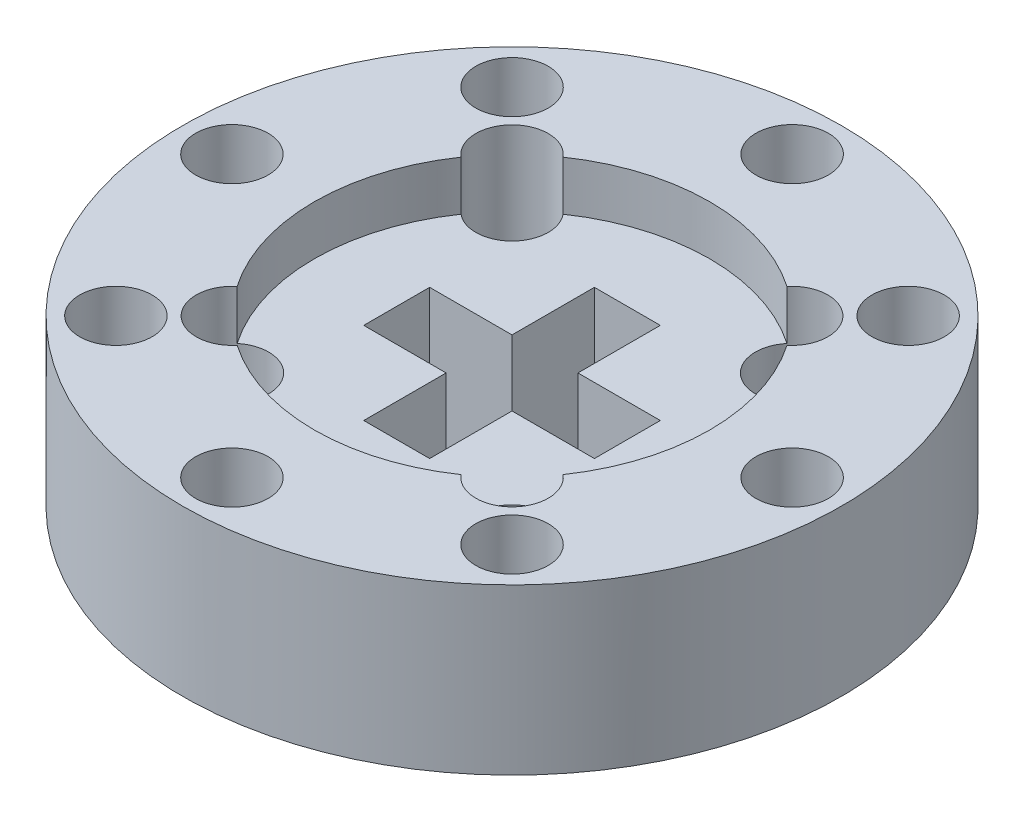
ISO-10303-21;
HEADER;
FILE_DESCRIPTION(('STEP AP214'),'2;1');
FILE_NAME('part.step','',(''),(''),'','','');
FILE_SCHEMA(('AUTOMOTIVE_DESIGN { 1 0 10303 214 1 1 1 1 }'));
ENDSEC;
DATA;
#1=APPLICATION_CONTEXT('core data for automotive mechanical design processes');
#2=APPLICATION_PROTOCOL_DEFINITION('international standard','automotive_design',2000,#1);
#3=PRODUCT_CONTEXT('',#1,'mechanical');
#4=PRODUCT('Part','Part','',(#3));
#5=PRODUCT_RELATED_PRODUCT_CATEGORY('part','',(#4));
#6=PRODUCT_DEFINITION_FORMATION('','',#4);
#7=PRODUCT_DEFINITION_CONTEXT('part definition',#1,'design');
#8=PRODUCT_DEFINITION('design','',#6,#7);
#9=PRODUCT_DEFINITION_SHAPE('','',#8);
#10=(LENGTH_UNIT() NAMED_UNIT(*) SI_UNIT(.MILLI.,.METRE.));
#11=(NAMED_UNIT(*) PLANE_ANGLE_UNIT() SI_UNIT($,.RADIAN.));
#12=(NAMED_UNIT(*) SI_UNIT($,.STERADIAN.) SOLID_ANGLE_UNIT());
#13=UNCERTAINTY_MEASURE_WITH_UNIT(LENGTH_MEASURE(1.E-05),#10,'distance_accuracy_value','');
#14=(GEOMETRIC_REPRESENTATION_CONTEXT(3) GLOBAL_UNCERTAINTY_ASSIGNED_CONTEXT((#13)) GLOBAL_UNIT_ASSIGNED_CONTEXT((#10,
#11,#12)) REPRESENTATION_CONTEXT('',''));
#15=CARTESIAN_POINT('',(0.,0.,0.));
#16=DIRECTION('',(0.,0.,1.));
#17=DIRECTION('',(1.,0.,0.));
#18=AXIS2_PLACEMENT_3D('',#15,#16,#17);
#19=CARTESIAN_POINT('',(0.,0.,0.));
#20=DIRECTION('',(0.,1.,0.));
#21=DIRECTION('',(0.,0.,1.));
#22=AXIS2_PLACEMENT_3D('',#19,#20,#21);
#23=PLANE('',#22);
#24=DIRECTION('',(0.,0.,-1.));
#25=VECTOR('',#24,1.);
#26=CARTESIAN_POINT('',(1.,0.,1.));
#27=LINE('',#26,#25);
#28=CARTESIAN_POINT('',(1.,0.,3.5));
#29=VERTEX_POINT('',#28);
#30=CARTESIAN_POINT('',(1.,0.,1.));
#31=VERTEX_POINT('',#30);
#32=EDGE_CURVE('E248',#29,#31,#27,.T.);
#33=ORIENTED_EDGE('',*,*,#32,.T.);
#34=DIRECTION('',(1.,0.,0.));
#35=VECTOR('',#34,1.);
#36=CARTESIAN_POINT('',(1.,0.,1.));
#37=LINE('',#36,#35);
#38=CARTESIAN_POINT('',(3.5,0.,1.));
#39=VERTEX_POINT('',#38);
#40=EDGE_CURVE('E255',#31,#39,#37,.T.);
#41=ORIENTED_EDGE('',*,*,#40,.T.);
#42=DIRECTION('',(0.,0.,-1.));
#43=VECTOR('',#42,1.);
#44=CARTESIAN_POINT('',(3.5,0.,-1.));
#45=LINE('',#44,#43);
#46=CARTESIAN_POINT('',(3.5,0.,-1.));
#47=VERTEX_POINT('',#46);
#48=EDGE_CURVE('E259',#39,#47,#45,.T.);
#49=ORIENTED_EDGE('',*,*,#48,.T.);
#50=DIRECTION('',(-1.,0.,0.));
#51=VECTOR('',#50,1.);
#52=CARTESIAN_POINT('',(1.,0.,-1.));
#53=LINE('',#52,#51);
#54=CARTESIAN_POINT('',(1.,0.,-1.));
#55=VERTEX_POINT('',#54);
#56=EDGE_CURVE('E263',#47,#55,#53,.T.);
#57=ORIENTED_EDGE('',*,*,#56,.T.);
#58=DIRECTION('',(0.,0.,-1.));
#59=VECTOR('',#58,1.);
#60=CARTESIAN_POINT('',(0.999999999999999,0.,-3.5));
#61=LINE('',#60,#59);
#62=CARTESIAN_POINT('',(0.999999999999999,0.,-3.5));
#63=VERTEX_POINT('',#62);
#64=EDGE_CURVE('E267',#55,#63,#61,.T.);
#65=ORIENTED_EDGE('',*,*,#64,.T.);
#66=DIRECTION('',(-1.,0.,0.));
#67=VECTOR('',#66,1.);
#68=CARTESIAN_POINT('',(-1.,0.,-3.5));
#69=LINE('',#68,#67);
#70=CARTESIAN_POINT('',(-1.,0.,-3.5));
#71=VERTEX_POINT('',#70);
#72=EDGE_CURVE('E271',#63,#71,#69,.T.);
#73=ORIENTED_EDGE('',*,*,#72,.T.);
#74=DIRECTION('',(0.,0.,1.));
#75=VECTOR('',#74,1.);
#76=CARTESIAN_POINT('',(-1.,0.,-3.5));
#77=LINE('',#76,#75);
#78=CARTESIAN_POINT('',(-1.,0.,-1.));
#79=VERTEX_POINT('',#78);
#80=EDGE_CURVE('E275',#71,#79,#77,.T.);
#81=ORIENTED_EDGE('',*,*,#80,.T.);
#82=DIRECTION('',(-1.,0.,0.));
#83=VECTOR('',#82,1.);
#84=CARTESIAN_POINT('',(-3.5,0.,-1.));
#85=LINE('',#84,#83);
#86=CARTESIAN_POINT('',(-3.5,0.,-1.));
#87=VERTEX_POINT('',#86);
#88=EDGE_CURVE('E279',#79,#87,#85,.T.);
#89=ORIENTED_EDGE('',*,*,#88,.T.);
#90=DIRECTION('',(0.,0.,1.));
#91=VECTOR('',#90,1.);
#92=CARTESIAN_POINT('',(-3.5,0.,-1.));
#93=LINE('',#92,#91);
#94=CARTESIAN_POINT('',(-3.5,0.,1.));
#95=VERTEX_POINT('',#94);
#96=EDGE_CURVE('E283',#87,#95,#93,.T.);
#97=ORIENTED_EDGE('',*,*,#96,.T.);
#98=DIRECTION('',(1.,0.,0.));
#99=VECTOR('',#98,1.);
#100=CARTESIAN_POINT('',(-3.5,0.,1.));
#101=LINE('',#100,#99);
#102=CARTESIAN_POINT('',(-1.,0.,1.));
#103=VERTEX_POINT('',#102);
#104=EDGE_CURVE('E287',#95,#103,#101,.T.);
#105=ORIENTED_EDGE('',*,*,#104,.T.);
#106=DIRECTION('',(0.,0.,1.));
#107=VECTOR('',#106,1.);
#108=CARTESIAN_POINT('',(-1.,0.,1.));
#109=LINE('',#108,#107);
#110=CARTESIAN_POINT('',(-1.,0.,3.5));
#111=VERTEX_POINT('',#110);
#112=EDGE_CURVE('E291',#103,#111,#109,.T.);
#113=ORIENTED_EDGE('',*,*,#112,.T.);
#114=DIRECTION('',(1.,0.,0.));
#115=VECTOR('',#114,1.);
#116=CARTESIAN_POINT('',(-1.,0.,3.5));
#117=LINE('',#116,#115);
#118=EDGE_CURVE('E295',#111,#29,#117,.T.);
#119=ORIENTED_EDGE('',*,*,#118,.T.);
#120=EDGE_LOOP('',(#33,#41,#49,#57,#65,#73,#81,#89,#97,#105,#113,#119));
#121=FACE_BOUND('',#120,.T.);
#122=CARTESIAN_POINT('',(0.,0.,0.));
#123=DIRECTION('',(0.,-1.,0.));
#124=DIRECTION('',(0.,0.,-1.));
#125=AXIS2_PLACEMENT_3D('',#122,#123,#124);
#126=CIRCLE('',#125,4.5);
#127=CARTESIAN_POINT('',(0.,0.,-4.5));
#128=VERTEX_POINT('',#127);
#129=EDGE_CURVE('E799',#128,#128,#126,.T.);
#130=ORIENTED_EDGE('',*,*,#129,.T.);
#131=EDGE_LOOP('',(#130));
#132=FACE_BOUND('',#131,.T.);
#133=ADVANCED_FACE('F38',(#121,#132),#23,.F.);
#134=CARTESIAN_POINT('',(0.,7.,0.));
#135=DIRECTION('',(0.,-1.,0.));
#136=DIRECTION('',(0.,0.,-1.));
#137=AXIS2_PLACEMENT_3D('',#134,#135,#136);
#138=CYLINDRICAL_SURFACE('',#137,10.);
#139=CARTESIAN_POINT('',(0.,7.,0.));
#140=DIRECTION('',(0.,1.,0.));
#141=DIRECTION('',(0.,0.,1.));
#142=AXIS2_PLACEMENT_3D('',#139,#140,#141);
#143=CIRCLE('',#142,10.);
#144=CARTESIAN_POINT('',(0.,7.,10.));
#145=VERTEX_POINT('',#144);
#146=EDGE_CURVE('E335',#145,#145,#143,.T.);
#147=ORIENTED_EDGE('',*,*,#146,.F.);
#148=EDGE_LOOP('',(#147));
#149=FACE_BOUND('',#148,.T.);
#150=CARTESIAN_POINT('',(0.,2.,0.));
#151=DIRECTION('',(0.,-1.,0.));
#152=DIRECTION('',(0.,0.,-1.));
#153=AXIS2_PLACEMENT_3D('',#150,#151,#152);
#154=CIRCLE('',#153,10.);
#155=CARTESIAN_POINT('',(0.,2.,-10.));
#156=VERTEX_POINT('',#155);
#157=EDGE_CURVE('E803',#156,#156,#154,.T.);
#158=ORIENTED_EDGE('',*,*,#157,.F.);
#159=EDGE_LOOP('',(#158));
#160=FACE_BOUND('',#159,.T.);
#161=ADVANCED_FACE('F40',(#149,#160),#138,.T.);
#162=CARTESIAN_POINT('',(6.01040764008566,0.,6.01040764008565));
#163=DIRECTION('',(0.,1.,0.));
#164=DIRECTION('',(0.,0.,1.));
#165=AXIS2_PLACEMENT_3D('',#162,#163,#164);
#166=CYLINDRICAL_SURFACE('',#165,1.1);
#167=CARTESIAN_POINT('',(6.01040764008566,7.,6.01040764008565));
#168=DIRECTION('',(0.,1.,0.));
#169=DIRECTION('',(0.,0.,1.));
#170=AXIS2_PLACEMENT_3D('',#167,#168,#169);
#171=CIRCLE('',#170,1.1);
#172=CARTESIAN_POINT('',(6.01040764008566,7.,7.11040764008565));
#173=VERTEX_POINT('',#172);
#174=EDGE_CURVE('E224',#173,#173,#171,.T.);
#175=ORIENTED_EDGE('',*,*,#174,.T.);
#176=EDGE_LOOP('',(#175));
#177=FACE_BOUND('',#176,.T.);
#178=CARTESIAN_POINT('',(6.01040764008566,2.,6.01040764008565));
#179=DIRECTION('',(0.,-1.,0.));
#180=DIRECTION('',(0.,0.,-1.));
#181=AXIS2_PLACEMENT_3D('',#178,#179,#180);
#182=CIRCLE('',#181,1.1);
#183=CARTESIAN_POINT('',(6.01040764008566,2.,4.91040764008565));
#184=VERTEX_POINT('',#183);
#185=EDGE_CURVE('E189',#184,#184,#182,.F.);
#186=ORIENTED_EDGE('',*,*,#185,.F.);
#187=EDGE_LOOP('',(#186));
#188=FACE_BOUND('',#187,.T.);
#189=ADVANCED_FACE('F469',(#177,#188),#166,.F.);
#190=CARTESIAN_POINT('',(-6.01040764008566,0.,-6.01040764008565));
#191=DIRECTION('',(0.,1.,0.));
#192=DIRECTION('',(0.,0.,1.));
#193=AXIS2_PLACEMENT_3D('',#190,#191,#192);
#194=CYLINDRICAL_SURFACE('',#193,1.1);
#195=CARTESIAN_POINT('',(-6.01040764008566,7.,-6.01040764008565));
#196=DIRECTION('',(0.,1.,0.));
#197=DIRECTION('',(0.,0.,1.));
#198=AXIS2_PLACEMENT_3D('',#195,#196,#197);
#199=CIRCLE('',#198,1.1);
#200=CARTESIAN_POINT('',(-6.01040764008566,7.,-4.91040764008565));
#201=VERTEX_POINT('',#200);
#202=EDGE_CURVE('E244',#201,#201,#199,.T.);
#203=ORIENTED_EDGE('',*,*,#202,.T.);
#204=EDGE_LOOP('',(#203));
#205=FACE_BOUND('',#204,.T.);
#206=CARTESIAN_POINT('',(-6.01040764008566,2.,-6.01040764008565));
#207=DIRECTION('',(0.,-1.,0.));
#208=DIRECTION('',(0.,0.,-1.));
#209=AXIS2_PLACEMENT_3D('',#206,#207,#208);
#210=CIRCLE('',#209,1.1);
#211=CARTESIAN_POINT('',(-6.01040764008566,2.,-7.11040764008565));
#212=VERTEX_POINT('',#211);
#213=EDGE_CURVE('E845',#212,#212,#210,.F.);
#214=ORIENTED_EDGE('',*,*,#213,.F.);
#215=EDGE_LOOP('',(#214));
#216=FACE_BOUND('',#215,.T.);
#217=ADVANCED_FACE('F525',(#205,#216),#194,.F.);
#218=CARTESIAN_POINT('',(-8.5,0.,0.));
#219=DIRECTION('',(0.,1.,0.));
#220=DIRECTION('',(0.,0.,1.));
#221=AXIS2_PLACEMENT_3D('',#218,#219,#220);
#222=CYLINDRICAL_SURFACE('',#221,1.1);
#223=CARTESIAN_POINT('',(-8.5,7.,0.));
#224=DIRECTION('',(0.,1.,0.));
#225=DIRECTION('',(-0.707106781186544,0.,-0.707106781186551));
#226=AXIS2_PLACEMENT_3D('',#223,#224,#225);
#227=CIRCLE('',#226,1.1);
#228=CARTESIAN_POINT('',(-9.2778174593052,7.,-0.777817459305247));
#229=VERTEX_POINT('',#228);
#230=EDGE_CURVE('E215',#229,#229,#227,.T.);
#231=ORIENTED_EDGE('',*,*,#230,.T.);
#232=EDGE_LOOP('',(#231));
#233=FACE_BOUND('',#232,.T.);
#234=CARTESIAN_POINT('',(-8.5,2.,0.));
#235=DIRECTION('',(0.,-1.,0.));
#236=DIRECTION('',(0.,0.,-1.));
#237=AXIS2_PLACEMENT_3D('',#234,#235,#236);
#238=CIRCLE('',#237,1.1);
#239=CARTESIAN_POINT('',(-8.5,2.,-1.10000000000004));
#240=VERTEX_POINT('',#239);
#241=EDGE_CURVE('E841',#240,#240,#238,.F.);
#242=ORIENTED_EDGE('',*,*,#241,.F.);
#243=EDGE_LOOP('',(#242));
#244=FACE_BOUND('',#243,.T.);
#245=ADVANCED_FACE('F529',(#233,#244),#222,.F.);
#246=CARTESIAN_POINT('',(0.,0.,8.5));
#247=DIRECTION('',(0.,1.,0.));
#248=DIRECTION('',(0.,0.,1.));
#249=AXIS2_PLACEMENT_3D('',#246,#247,#248);
#250=CYLINDRICAL_SURFACE('',#249,1.1);
#251=CARTESIAN_POINT('',(0.,7.,8.5));
#252=DIRECTION('',(0.,1.,0.));
#253=DIRECTION('',(-0.707106781186549,0.,0.707106781186546));
#254=AXIS2_PLACEMENT_3D('',#251,#252,#253);
#255=CIRCLE('',#254,1.1);
#256=CARTESIAN_POINT('',(-0.777817459305214,7.,9.2778174593052));
#257=VERTEX_POINT('',#256);
#258=EDGE_CURVE('E225',#257,#257,#255,.T.);
#259=ORIENTED_EDGE('',*,*,#258,.T.);
#260=EDGE_LOOP('',(#259));
#261=FACE_BOUND('',#260,.T.);
#262=CARTESIAN_POINT('',(0.,2.,8.5));
#263=DIRECTION('',(0.,-1.,0.));
#264=DIRECTION('',(0.,0.,-1.));
#265=AXIS2_PLACEMENT_3D('',#262,#263,#264);
#266=CIRCLE('',#265,1.1);
#267=CARTESIAN_POINT('',(0.,2.,7.4));
#268=VERTEX_POINT('',#267);
#269=EDGE_CURVE('E837',#268,#268,#266,.F.);
#270=ORIENTED_EDGE('',*,*,#269,.F.);
#271=EDGE_LOOP('',(#270));
#272=FACE_BOUND('',#271,.T.);
#273=ADVANCED_FACE('F533',(#261,#272),#250,.F.);
#274=CARTESIAN_POINT('',(6.01040764008567,0.,-6.01040764008563));
#275=DIRECTION('',(0.,1.,0.));
#276=DIRECTION('',(0.,0.,1.));
#277=AXIS2_PLACEMENT_3D('',#274,#275,#276);
#278=CYLINDRICAL_SURFACE('',#277,1.1);
#279=CARTESIAN_POINT('',(6.01040764008567,7.,-6.01040764008563));
#280=DIRECTION('',(0.,1.,0.));
#281=DIRECTION('',(-1.,0.,0.));
#282=AXIS2_PLACEMENT_3D('',#279,#280,#281);
#283=CIRCLE('',#282,1.1);
#284=CARTESIAN_POINT('',(4.91040764008567,7.,-6.01040764008564));
#285=VERTEX_POINT('',#284);
#286=EDGE_CURVE('E230',#285,#285,#283,.T.);
#287=ORIENTED_EDGE('',*,*,#286,.T.);
#288=EDGE_LOOP('',(#287));
#289=FACE_BOUND('',#288,.T.);
#290=CARTESIAN_POINT('',(6.01040764008567,2.,-6.01040764008563));
#291=DIRECTION('',(0.,-1.,0.));
#292=DIRECTION('',(0.,0.,-1.));
#293=AXIS2_PLACEMENT_3D('',#290,#291,#292);
#294=CIRCLE('',#293,1.1);
#295=CARTESIAN_POINT('',(6.01040764008567,2.,-7.11040764008564));
#296=VERTEX_POINT('',#295);
#297=EDGE_CURVE('E833',#296,#296,#294,.F.);
#298=ORIENTED_EDGE('',*,*,#297,.F.);
#299=EDGE_LOOP('',(#298));
#300=FACE_BOUND('',#299,.T.);
#301=ADVANCED_FACE('F535',(#289,#300),#278,.F.);
#302=CARTESIAN_POINT('',(-6.01040764008567,0.,6.01040764008564));
#303=DIRECTION('',(0.,1.,0.));
#304=DIRECTION('',(0.,0.,1.));
#305=AXIS2_PLACEMENT_3D('',#302,#303,#304);
#306=CYLINDRICAL_SURFACE('',#305,1.1);
#307=CARTESIAN_POINT('',(-6.01040764008567,7.,6.01040764008564));
#308=DIRECTION('',(0.,1.,0.));
#309=DIRECTION('',(-1.,0.,0.));
#310=AXIS2_PLACEMENT_3D('',#307,#308,#309);
#311=CIRCLE('',#310,1.1);
#312=CARTESIAN_POINT('',(-7.11040764008567,7.,6.01040764008563));
#313=VERTEX_POINT('',#312);
#314=EDGE_CURVE('E226',#313,#313,#311,.T.);
#315=ORIENTED_EDGE('',*,*,#314,.T.);
#316=EDGE_LOOP('',(#315));
#317=FACE_BOUND('',#316,.T.);
#318=CARTESIAN_POINT('',(-6.01040764008567,2.,6.01040764008564));
#319=DIRECTION('',(0.,-1.,0.));
#320=DIRECTION('',(0.,0.,-1.));
#321=AXIS2_PLACEMENT_3D('',#318,#319,#320);
#322=CIRCLE('',#321,1.1);
#323=CARTESIAN_POINT('',(-6.01040764008567,2.,4.91040764008564));
#324=VERTEX_POINT('',#323);
#325=EDGE_CURVE('E829',#324,#324,#322,.F.);
#326=ORIENTED_EDGE('',*,*,#325,.F.);
#327=EDGE_LOOP('',(#326));
#328=FACE_BOUND('',#327,.T.);
#329=ADVANCED_FACE('F538',(#317,#328),#306,.F.);
#330=CARTESIAN_POINT('',(8.5,0.,0.));
#331=DIRECTION('',(0.,1.,0.));
#332=DIRECTION('',(0.,0.,1.));
#333=AXIS2_PLACEMENT_3D('',#330,#331,#332);
#334=CYLINDRICAL_SURFACE('',#333,1.1);
#335=CARTESIAN_POINT('',(8.5,7.,0.));
#336=DIRECTION('',(0.,1.,0.));
#337=DIRECTION('',(-0.707106781186544,0.,-0.707106781186551));
#338=AXIS2_PLACEMENT_3D('',#335,#336,#337);
#339=CIRCLE('',#338,1.1);
#340=CARTESIAN_POINT('',(7.7221825406948,7.,-0.777817459305164));
#341=VERTEX_POINT('',#340);
#342=EDGE_CURVE('E231',#341,#341,#339,.T.);
#343=ORIENTED_EDGE('',*,*,#342,.T.);
#344=EDGE_LOOP('',(#343));
#345=FACE_BOUND('',#344,.T.);
#346=CARTESIAN_POINT('',(8.5,2.,0.));
#347=DIRECTION('',(0.,-1.,0.));
#348=DIRECTION('',(0.,0.,-1.));
#349=AXIS2_PLACEMENT_3D('',#346,#347,#348);
#350=CIRCLE('',#349,1.1);
#351=CARTESIAN_POINT('',(8.5,2.,-1.09999999999996));
#352=VERTEX_POINT('',#351);
#353=EDGE_CURVE('E825',#352,#352,#350,.F.);
#354=ORIENTED_EDGE('',*,*,#353,.F.);
#355=EDGE_LOOP('',(#354));
#356=FACE_BOUND('',#355,.T.);
#357=ADVANCED_FACE('F543',(#345,#356),#334,.F.);
#358=CARTESIAN_POINT('',(0.,0.,-8.5));
#359=DIRECTION('',(0.,1.,0.));
#360=DIRECTION('',(0.,0.,1.));
#361=AXIS2_PLACEMENT_3D('',#358,#359,#360);
#362=CYLINDRICAL_SURFACE('',#361,1.1);
#363=CARTESIAN_POINT('',(0.,7.,-8.5));
#364=DIRECTION('',(0.,1.,0.));
#365=DIRECTION('',(-0.707106781186549,0.,0.707106781186546));
#366=AXIS2_PLACEMENT_3D('',#363,#364,#365);
#367=CIRCLE('',#366,1.1);
#368=CARTESIAN_POINT('',(-0.777817459305191,7.,-7.7221825406948));
#369=VERTEX_POINT('',#368);
#370=EDGE_CURVE('E220',#369,#369,#367,.T.);
#371=ORIENTED_EDGE('',*,*,#370,.T.);
#372=EDGE_LOOP('',(#371));
#373=FACE_BOUND('',#372,.T.);
#374=CARTESIAN_POINT('',(0.,2.,-8.5));
#375=DIRECTION('',(0.,-1.,0.));
#376=DIRECTION('',(0.,0.,-1.));
#377=AXIS2_PLACEMENT_3D('',#374,#375,#376);
#378=CIRCLE('',#377,1.1);
#379=CARTESIAN_POINT('',(0.,2.,-9.6));
#380=VERTEX_POINT('',#379);
#381=EDGE_CURVE('E821',#380,#380,#378,.F.);
#382=ORIENTED_EDGE('',*,*,#381,.F.);
#383=EDGE_LOOP('',(#382));
#384=FACE_BOUND('',#383,.T.);
#385=ADVANCED_FACE('F546',(#373,#384),#362,.F.);
#386=CARTESIAN_POINT('',(4.24264068711929,0.,4.24264068711928));
#387=DIRECTION('',(0.,1.,0.));
#388=DIRECTION('',(0.,0.,1.));
#389=AXIS2_PLACEMENT_3D('',#386,#387,#388);
#390=CYLINDRICAL_SURFACE('',#389,1.1);
#391=CARTESIAN_POINT('',(4.24264068711929,5.5,4.24264068711928));
#392=DIRECTION('',(0.,1.,0.));
#393=DIRECTION('',(0.,0.,1.));
#394=AXIS2_PLACEMENT_3D('',#391,#392,#393);
#395=CIRCLE('',#394,1.1);
#396=CARTESIAN_POINT('',(3.39679810155799,5.5,4.94588340514129));
#397=VERTEX_POINT('',#396);
#398=CARTESIAN_POINT('',(4.9458834051413,5.5,3.39679810155798));
#399=VERTEX_POINT('',#398);
#400=EDGE_CURVE('E199',#397,#399,#395,.F.);
#401=ORIENTED_EDGE('',*,*,#400,.F.);
#402=DIRECTION('',(0.,1.,0.));
#403=VECTOR('',#402,1.);
#404=CARTESIAN_POINT('',(3.39679810155799,6.25,4.94588340514129));
#405=LINE('',#404,#403);
#406=CARTESIAN_POINT('',(3.39679810155799,7.,4.94588340514129));
#407=VERTEX_POINT('',#406);
#408=EDGE_CURVE('E180',#397,#407,#405,.T.);
#409=ORIENTED_EDGE('',*,*,#408,.T.);
#410=CARTESIAN_POINT('',(4.24264068711929,7.,4.24264068711928));
#411=DIRECTION('',(0.,1.,0.));
#412=DIRECTION('',(0.,0.,1.));
#413=AXIS2_PLACEMENT_3D('',#410,#411,#412);
#414=CIRCLE('',#413,1.1);
#415=CARTESIAN_POINT('',(4.9458834051413,7.,3.39679810155798));
#416=VERTEX_POINT('',#415);
#417=EDGE_CURVE('E198',#407,#416,#414,.T.);
#418=ORIENTED_EDGE('',*,*,#417,.T.);
#419=DIRECTION('',(0.,1.,0.));
#420=VECTOR('',#419,1.);
#421=CARTESIAN_POINT('',(4.9458834051413,6.25,3.39679810155798));
#422=LINE('',#421,#420);
#423=EDGE_CURVE('E202',#416,#399,#422,.F.);
#424=ORIENTED_EDGE('',*,*,#423,.T.);
#425=EDGE_LOOP('',(#401,#409,#418,#424));
#426=FACE_BOUND('',#425,.T.);
#427=CARTESIAN_POINT('',(4.24264068711929,2.,4.24264068711928));
#428=DIRECTION('',(0.,-1.,0.));
#429=DIRECTION('',(0.,0.,-1.));
#430=AXIS2_PLACEMENT_3D('',#427,#428,#429);
#431=CIRCLE('',#430,1.1);
#432=CARTESIAN_POINT('',(4.24264068711929,2.,3.14264068711928));
#433=VERTEX_POINT('',#432);
#434=EDGE_CURVE('E817',#433,#433,#431,.F.);
#435=ORIENTED_EDGE('',*,*,#434,.F.);
#436=EDGE_LOOP('',(#435));
#437=FACE_BOUND('',#436,.T.);
#438=ADVANCED_FACE('F195',(#426,#437),#390,.F.);
#439=CARTESIAN_POINT('',(-4.24264068711928,0.,-4.24264068711928));
#440=DIRECTION('',(0.,1.,0.));
#441=DIRECTION('',(0.,0.,1.));
#442=AXIS2_PLACEMENT_3D('',#439,#440,#441);
#443=CYLINDRICAL_SURFACE('',#442,1.1);
#444=CARTESIAN_POINT('',(-4.24264068711928,5.5,-4.24264068711928));
#445=DIRECTION('',(0.,1.,0.));
#446=DIRECTION('',(0.,0.,1.));
#447=AXIS2_PLACEMENT_3D('',#444,#445,#446);
#448=CIRCLE('',#447,1.1);
#449=CARTESIAN_POINT('',(-3.39679810155799,5.5,-4.9458834051413));
#450=VERTEX_POINT('',#449);
#451=CARTESIAN_POINT('',(-4.9458834051413,5.5,-3.39679810155799));
#452=VERTEX_POINT('',#451);
#453=EDGE_CURVE('E361',#450,#452,#448,.F.);
#454=ORIENTED_EDGE('',*,*,#453,.F.);
#455=DIRECTION('',(0.,1.,0.));
#456=VECTOR('',#455,1.);
#457=CARTESIAN_POINT('',(-3.39679810155799,6.25,-4.94588340514129));
#458=LINE('',#457,#456);
#459=CARTESIAN_POINT('',(-3.39679810155799,7.,-4.9458834051413));
#460=VERTEX_POINT('',#459);
#461=EDGE_CURVE('E360',#450,#460,#458,.T.);
#462=ORIENTED_EDGE('',*,*,#461,.T.);
#463=CARTESIAN_POINT('',(-4.24264068711928,7.,-4.24264068711928));
#464=DIRECTION('',(0.,1.,0.));
#465=DIRECTION('',(0.,0.,1.));
#466=AXIS2_PLACEMENT_3D('',#463,#464,#465);
#467=CIRCLE('',#466,1.1);
#468=CARTESIAN_POINT('',(-4.9458834051413,7.,-3.39679810155799));
#469=VERTEX_POINT('',#468);
#470=EDGE_CURVE('E209',#460,#469,#467,.T.);
#471=ORIENTED_EDGE('',*,*,#470,.T.);
#472=DIRECTION('',(0.,1.,0.));
#473=VECTOR('',#472,1.);
#474=CARTESIAN_POINT('',(-4.94588340514129,6.25,-3.39679810155799));
#475=LINE('',#474,#473);
#476=EDGE_CURVE('E359',#469,#452,#475,.F.);
#477=ORIENTED_EDGE('',*,*,#476,.T.);
#478=EDGE_LOOP('',(#454,#462,#471,#477));
#479=FACE_BOUND('',#478,.T.);
#480=CARTESIAN_POINT('',(-4.24264068711928,2.,-4.24264068711928));
#481=DIRECTION('',(0.,-1.,0.));
#482=DIRECTION('',(0.,0.,-1.));
#483=AXIS2_PLACEMENT_3D('',#480,#481,#482);
#484=CIRCLE('',#483,1.1);
#485=CARTESIAN_POINT('',(-4.24264068711928,2.,-5.34264068711929));
#486=VERTEX_POINT('',#485);
#487=EDGE_CURVE('E813',#486,#486,#484,.F.);
#488=ORIENTED_EDGE('',*,*,#487,.F.);
#489=EDGE_LOOP('',(#488));
#490=FACE_BOUND('',#489,.T.);
#491=ADVANCED_FACE('F357',(#479,#490),#443,.F.);
#492=CARTESIAN_POINT('',(4.24264068711927,0.,-4.2426406871193));
#493=DIRECTION('',(0.,1.,0.));
#494=DIRECTION('',(0.,0.,1.));
#495=AXIS2_PLACEMENT_3D('',#492,#493,#494);
#496=CYLINDRICAL_SURFACE('',#495,1.1);
#497=CARTESIAN_POINT('',(4.24264068711927,5.5,-4.2426406871193));
#498=DIRECTION('',(0.,1.,0.));
#499=DIRECTION('',(0.,0.,1.));
#500=AXIS2_PLACEMENT_3D('',#497,#498,#499);
#501=CIRCLE('',#500,1.1);
#502=CARTESIAN_POINT('',(4.94588340514128,5.5,-3.39679810155801));
#503=VERTEX_POINT('',#502);
#504=CARTESIAN_POINT('',(3.39679810155796,5.5,-4.94588340514131));
#505=VERTEX_POINT('',#504);
#506=EDGE_CURVE('E388',#503,#505,#501,.F.);
#507=ORIENTED_EDGE('',*,*,#506,.F.);
#508=DIRECTION('',(0.,1.,0.));
#509=VECTOR('',#508,1.);
#510=CARTESIAN_POINT('',(4.94588340514128,6.25,-3.39679810155801));
#511=LINE('',#510,#509);
#512=CARTESIAN_POINT('',(4.94588340514128,7.,-3.39679810155801));
#513=VERTEX_POINT('',#512);
#514=EDGE_CURVE('E370',#503,#513,#511,.T.);
#515=ORIENTED_EDGE('',*,*,#514,.T.);
#516=CARTESIAN_POINT('',(4.24264068711927,7.,-4.2426406871193));
#517=DIRECTION('',(0.,1.,0.));
#518=DIRECTION('',(1.,0.,0.));
#519=AXIS2_PLACEMENT_3D('',#516,#517,#518);
#520=CIRCLE('',#519,1.1);
#521=CARTESIAN_POINT('',(3.39679810155796,7.,-4.94588340514131));
#522=VERTEX_POINT('',#521);
#523=EDGE_CURVE('E201',#513,#522,#520,.T.);
#524=ORIENTED_EDGE('',*,*,#523,.T.);
#525=DIRECTION('',(0.,1.,0.));
#526=VECTOR('',#525,1.);
#527=CARTESIAN_POINT('',(3.39679810155797,6.25,-4.94588340514131));
#528=LINE('',#527,#526);
#529=EDGE_CURVE('E381',#522,#505,#528,.F.);
#530=ORIENTED_EDGE('',*,*,#529,.T.);
#531=EDGE_LOOP('',(#507,#515,#524,#530));
#532=FACE_BOUND('',#531,.T.);
#533=CARTESIAN_POINT('',(4.24264068711927,2.,-4.2426406871193));
#534=DIRECTION('',(0.,-1.,0.));
#535=DIRECTION('',(0.,0.,-1.));
#536=AXIS2_PLACEMENT_3D('',#533,#534,#535);
#537=CIRCLE('',#536,1.1);
#538=CARTESIAN_POINT('',(4.24264068711927,2.,-5.3426406871193));
#539=VERTEX_POINT('',#538);
#540=EDGE_CURVE('E809',#539,#539,#537,.F.);
#541=ORIENTED_EDGE('',*,*,#540,.F.);
#542=EDGE_LOOP('',(#541));
#543=FACE_BOUND('',#542,.T.);
#544=ADVANCED_FACE('F379',(#532,#543),#496,.F.);
#545=CARTESIAN_POINT('',(-4.24264068711927,0.,4.2426406871193));
#546=DIRECTION('',(0.,1.,0.));
#547=DIRECTION('',(0.,0.,1.));
#548=AXIS2_PLACEMENT_3D('',#545,#546,#547);
#549=CYLINDRICAL_SURFACE('',#548,1.1);
#550=CARTESIAN_POINT('',(-4.24264068711927,5.5,4.2426406871193));
#551=DIRECTION('',(0.,1.,0.));
#552=DIRECTION('',(0.,0.,1.));
#553=AXIS2_PLACEMENT_3D('',#550,#551,#552);
#554=CIRCLE('',#553,1.1);
#555=CARTESIAN_POINT('',(-4.94588340514129,5.5,3.396798101558));
#556=VERTEX_POINT('',#555);
#557=CARTESIAN_POINT('',(-3.39679810155797,5.5,4.94588340514131));
#558=VERTEX_POINT('',#557);
#559=EDGE_CURVE('E339',#556,#558,#554,.F.);
#560=ORIENTED_EDGE('',*,*,#559,.F.);
#561=DIRECTION('',(0.,1.,0.));
#562=VECTOR('',#561,1.);
#563=CARTESIAN_POINT('',(-4.94588340514128,6.25,3.39679810155801));
#564=LINE('',#563,#562);
#565=CARTESIAN_POINT('',(-4.94588340514129,7.,3.396798101558));
#566=VERTEX_POINT('',#565);
#567=EDGE_CURVE('E11',#556,#566,#564,.T.);
#568=ORIENTED_EDGE('',*,*,#567,.T.);
#569=CARTESIAN_POINT('',(-4.24264068711927,7.,4.2426406871193));
#570=DIRECTION('',(0.,1.,0.));
#571=DIRECTION('',(1.,0.,0.));
#572=AXIS2_PLACEMENT_3D('',#569,#570,#571);
#573=CIRCLE('',#572,1.1);
#574=CARTESIAN_POINT('',(-3.39679810155797,7.,4.94588340514131));
#575=VERTEX_POINT('',#574);
#576=EDGE_CURVE('E210',#566,#575,#573,.T.);
#577=ORIENTED_EDGE('',*,*,#576,.T.);
#578=DIRECTION('',(0.,1.,0.));
#579=VECTOR('',#578,1.);
#580=CARTESIAN_POINT('',(-3.39679810155797,6.25,4.94588340514131));
#581=LINE('',#580,#579);
#582=EDGE_CURVE('E48',#575,#558,#581,.F.);
#583=ORIENTED_EDGE('',*,*,#582,.T.);
#584=EDGE_LOOP('',(#560,#568,#577,#583));
#585=FACE_BOUND('',#584,.T.);
#586=CARTESIAN_POINT('',(-4.24264068711927,2.,4.2426406871193));
#587=DIRECTION('',(0.,-1.,0.));
#588=DIRECTION('',(0.,0.,-1.));
#589=AXIS2_PLACEMENT_3D('',#586,#587,#588);
#590=CIRCLE('',#589,1.1);
#591=CARTESIAN_POINT('',(-4.24264068711927,2.,3.1426406871193));
#592=VERTEX_POINT('',#591);
#593=EDGE_CURVE('E42',#592,#592,#590,.F.);
#594=ORIENTED_EDGE('',*,*,#593,.F.);
#595=EDGE_LOOP('',(#594));
#596=FACE_BOUND('',#595,.T.);
#597=ADVANCED_FACE('F345',(#585,#596),#549,.F.);
#598=CARTESIAN_POINT('',(1.,7.,1.));
#599=DIRECTION('',(-1.,0.,0.));
#600=DIRECTION('',(0.,0.,1.));
#601=AXIS2_PLACEMENT_3D('',#598,#599,#600);
#602=PLANE('',#601);
#603=DIRECTION('',(0.,-1.,0.));
#604=VECTOR('',#603,1.);
#605=CARTESIAN_POINT('',(1.,7.,3.5));
#606=LINE('',#605,#604);
#607=CARTESIAN_POINT('',(1.,5.5,3.5));
#608=VERTEX_POINT('',#607);
#609=EDGE_CURVE('E299',#608,#29,#606,.T.);
#610=ORIENTED_EDGE('',*,*,#609,.F.);
#611=DIRECTION('',(0.,0.,-1.));
#612=VECTOR('',#611,1.);
#613=CARTESIAN_POINT('',(1.,5.5,1.));
#614=LINE('',#613,#612);
#615=CARTESIAN_POINT('',(1.,5.5,1.));
#616=VERTEX_POINT('',#615);
#617=EDGE_CURVE('E55',#608,#616,#614,.T.);
#618=ORIENTED_EDGE('',*,*,#617,.T.);
#619=DIRECTION('',(0.,-1.,0.));
#620=VECTOR('',#619,1.);
#621=CARTESIAN_POINT('',(1.,7.,1.));
#622=LINE('',#621,#620);
#623=EDGE_CURVE('E332',#616,#31,#622,.T.);
#624=ORIENTED_EDGE('',*,*,#623,.T.);
#625=ORIENTED_EDGE('',*,*,#32,.F.);
#626=EDGE_LOOP('',(#610,#618,#624,#625));
#627=FACE_BOUND('',#626,.T.);
#628=ADVANCED_FACE('F476',(#627),#602,.T.);
#629=CARTESIAN_POINT('',(1.,7.,1.));
#630=DIRECTION('',(0.,0.,-1.));
#631=DIRECTION('',(-1.,0.,0.));
#632=AXIS2_PLACEMENT_3D('',#629,#630,#631);
#633=PLANE('',#632);
#634=ORIENTED_EDGE('',*,*,#623,.F.);
#635=DIRECTION('',(1.,0.,0.));
#636=VECTOR('',#635,1.);
#637=CARTESIAN_POINT('',(1.,5.5,1.));
#638=LINE('',#637,#636);
#639=CARTESIAN_POINT('',(3.5,5.5,1.));
#640=VERTEX_POINT('',#639);
#641=EDGE_CURVE('E435',#616,#640,#638,.T.);
#642=ORIENTED_EDGE('',*,*,#641,.T.);
#643=DIRECTION('',(0.,-1.,0.));
#644=VECTOR('',#643,1.);
#645=CARTESIAN_POINT('',(3.5,7.,1.));
#646=LINE('',#645,#644);
#647=EDGE_CURVE('E329',#640,#39,#646,.T.);
#648=ORIENTED_EDGE('',*,*,#647,.T.);
#649=ORIENTED_EDGE('',*,*,#40,.F.);
#650=EDGE_LOOP('',(#634,#642,#648,#649));
#651=FACE_BOUND('',#650,.T.);
#652=ADVANCED_FACE('F479',(#651),#633,.T.);
#653=CARTESIAN_POINT('',(3.5,7.,-1.));
#654=DIRECTION('',(-1.,0.,0.));
#655=DIRECTION('',(0.,0.,1.));
#656=AXIS2_PLACEMENT_3D('',#653,#654,#655);
#657=PLANE('',#656);
#658=ORIENTED_EDGE('',*,*,#647,.F.);
#659=DIRECTION('',(0.,0.,-1.));
#660=VECTOR('',#659,1.);
#661=CARTESIAN_POINT('',(3.5,5.5,-1.));
#662=LINE('',#661,#660);
#663=CARTESIAN_POINT('',(3.5,5.5,-1.));
#664=VERTEX_POINT('',#663);
#665=EDGE_CURVE('E431',#640,#664,#662,.T.);
#666=ORIENTED_EDGE('',*,*,#665,.T.);
#667=DIRECTION('',(0.,-1.,0.));
#668=VECTOR('',#667,1.);
#669=CARTESIAN_POINT('',(3.5,7.,-1.));
#670=LINE('',#669,#668);
#671=EDGE_CURVE('E326',#664,#47,#670,.T.);
#672=ORIENTED_EDGE('',*,*,#671,.T.);
#673=ORIENTED_EDGE('',*,*,#48,.F.);
#674=EDGE_LOOP('',(#658,#666,#672,#673));
#675=FACE_BOUND('',#674,.T.);
#676=ADVANCED_FACE('F483',(#675),#657,.T.);
#677=CARTESIAN_POINT('',(1.,7.,-1.));
#678=DIRECTION('',(0.,0.,1.));
#679=DIRECTION('',(1.,0.,0.));
#680=AXIS2_PLACEMENT_3D('',#677,#678,#679);
#681=PLANE('',#680);
#682=ORIENTED_EDGE('',*,*,#671,.F.);
#683=DIRECTION('',(-1.,0.,0.));
#684=VECTOR('',#683,1.);
#685=CARTESIAN_POINT('',(1.,5.5,-1.));
#686=LINE('',#685,#684);
#687=CARTESIAN_POINT('',(1.,5.5,-1.));
#688=VERTEX_POINT('',#687);
#689=EDGE_CURVE('E427',#664,#688,#686,.T.);
#690=ORIENTED_EDGE('',*,*,#689,.T.);
#691=DIRECTION('',(0.,-1.,0.));
#692=VECTOR('',#691,1.);
#693=CARTESIAN_POINT('',(1.,7.,-1.));
#694=LINE('',#693,#692);
#695=EDGE_CURVE('E323',#688,#55,#694,.T.);
#696=ORIENTED_EDGE('',*,*,#695,.T.);
#697=ORIENTED_EDGE('',*,*,#56,.F.);
#698=EDGE_LOOP('',(#682,#690,#696,#697));
#699=FACE_BOUND('',#698,.T.);
#700=ADVANCED_FACE('F487',(#699),#681,.T.);
#701=CARTESIAN_POINT('',(0.999999999999999,7.,-3.5));
#702=DIRECTION('',(-1.,0.,0.));
#703=DIRECTION('',(0.,0.,1.));
#704=AXIS2_PLACEMENT_3D('',#701,#702,#703);
#705=PLANE('',#704);
#706=ORIENTED_EDGE('',*,*,#695,.F.);
#707=DIRECTION('',(0.,0.,-1.));
#708=VECTOR('',#707,1.);
#709=CARTESIAN_POINT('',(0.999999999999999,5.5,-3.5));
#710=LINE('',#709,#708);
#711=CARTESIAN_POINT('',(0.999999999999999,5.5,-3.5));
#712=VERTEX_POINT('',#711);
#713=EDGE_CURVE('E423',#688,#712,#710,.T.);
#714=ORIENTED_EDGE('',*,*,#713,.T.);
#715=DIRECTION('',(0.,-1.,0.));
#716=VECTOR('',#715,1.);
#717=CARTESIAN_POINT('',(0.999999999999999,7.,-3.5));
#718=LINE('',#717,#716);
#719=EDGE_CURVE('E320',#712,#63,#718,.T.);
#720=ORIENTED_EDGE('',*,*,#719,.T.);
#721=ORIENTED_EDGE('',*,*,#64,.F.);
#722=EDGE_LOOP('',(#706,#714,#720,#721));
#723=FACE_BOUND('',#722,.T.);
#724=ADVANCED_FACE('F491',(#723),#705,.T.);
#725=CARTESIAN_POINT('',(-1.,7.,-3.5));
#726=DIRECTION('',(0.,0.,1.));
#727=DIRECTION('',(1.,0.,0.));
#728=AXIS2_PLACEMENT_3D('',#725,#726,#727);
#729=PLANE('',#728);
#730=ORIENTED_EDGE('',*,*,#719,.F.);
#731=DIRECTION('',(-1.,0.,0.));
#732=VECTOR('',#731,1.);
#733=CARTESIAN_POINT('',(-1.,5.5,-3.5));
#734=LINE('',#733,#732);
#735=CARTESIAN_POINT('',(-1.,5.5,-3.5));
#736=VERTEX_POINT('',#735);
#737=EDGE_CURVE('E419',#712,#736,#734,.T.);
#738=ORIENTED_EDGE('',*,*,#737,.T.);
#739=DIRECTION('',(0.,-1.,0.));
#740=VECTOR('',#739,1.);
#741=CARTESIAN_POINT('',(-1.,7.,-3.5));
#742=LINE('',#741,#740);
#743=EDGE_CURVE('E317',#736,#71,#742,.T.);
#744=ORIENTED_EDGE('',*,*,#743,.T.);
#745=ORIENTED_EDGE('',*,*,#72,.F.);
#746=EDGE_LOOP('',(#730,#738,#744,#745));
#747=FACE_BOUND('',#746,.T.);
#748=ADVANCED_FACE('F495',(#747),#729,.T.);
#749=CARTESIAN_POINT('',(-1.,7.,-3.5));
#750=DIRECTION('',(1.,0.,0.));
#751=DIRECTION('',(0.,0.,-1.));
#752=AXIS2_PLACEMENT_3D('',#749,#750,#751);
#753=PLANE('',#752);
#754=ORIENTED_EDGE('',*,*,#743,.F.);
#755=DIRECTION('',(0.,0.,1.));
#756=VECTOR('',#755,1.);
#757=CARTESIAN_POINT('',(-1.,5.5,-3.5));
#758=LINE('',#757,#756);
#759=CARTESIAN_POINT('',(-1.,5.5,-1.));
#760=VERTEX_POINT('',#759);
#761=EDGE_CURVE('E415',#736,#760,#758,.T.);
#762=ORIENTED_EDGE('',*,*,#761,.T.);
#763=DIRECTION('',(0.,-1.,0.));
#764=VECTOR('',#763,1.);
#765=CARTESIAN_POINT('',(-1.,7.,-1.));
#766=LINE('',#765,#764);
#767=EDGE_CURVE('E314',#760,#79,#766,.T.);
#768=ORIENTED_EDGE('',*,*,#767,.T.);
#769=ORIENTED_EDGE('',*,*,#80,.F.);
#770=EDGE_LOOP('',(#754,#762,#768,#769));
#771=FACE_BOUND('',#770,.T.);
#772=ADVANCED_FACE('F499',(#771),#753,.T.);
#773=CARTESIAN_POINT('',(-3.5,7.,-1.));
#774=DIRECTION('',(0.,0.,1.));
#775=DIRECTION('',(1.,0.,0.));
#776=AXIS2_PLACEMENT_3D('',#773,#774,#775);
#777=PLANE('',#776);
#778=ORIENTED_EDGE('',*,*,#767,.F.);
#779=DIRECTION('',(-1.,0.,0.));
#780=VECTOR('',#779,1.);
#781=CARTESIAN_POINT('',(-3.5,5.5,-1.));
#782=LINE('',#781,#780);
#783=CARTESIAN_POINT('',(-3.5,5.5,-1.));
#784=VERTEX_POINT('',#783);
#785=EDGE_CURVE('E411',#760,#784,#782,.T.);
#786=ORIENTED_EDGE('',*,*,#785,.T.);
#787=DIRECTION('',(0.,-1.,0.));
#788=VECTOR('',#787,1.);
#789=CARTESIAN_POINT('',(-3.5,7.,-1.));
#790=LINE('',#789,#788);
#791=EDGE_CURVE('E311',#784,#87,#790,.T.);
#792=ORIENTED_EDGE('',*,*,#791,.T.);
#793=ORIENTED_EDGE('',*,*,#88,.F.);
#794=EDGE_LOOP('',(#778,#786,#792,#793));
#795=FACE_BOUND('',#794,.T.);
#796=ADVANCED_FACE('F503',(#795),#777,.T.);
#797=CARTESIAN_POINT('',(-3.5,7.,-1.));
#798=DIRECTION('',(1.,0.,0.));
#799=DIRECTION('',(0.,0.,-1.));
#800=AXIS2_PLACEMENT_3D('',#797,#798,#799);
#801=PLANE('',#800);
#802=ORIENTED_EDGE('',*,*,#791,.F.);
#803=DIRECTION('',(0.,0.,1.));
#804=VECTOR('',#803,1.);
#805=CARTESIAN_POINT('',(-3.5,5.5,-1.));
#806=LINE('',#805,#804);
#807=CARTESIAN_POINT('',(-3.5,5.5,1.));
#808=VERTEX_POINT('',#807);
#809=EDGE_CURVE('E407',#784,#808,#806,.T.);
#810=ORIENTED_EDGE('',*,*,#809,.T.);
#811=DIRECTION('',(0.,-1.,0.));
#812=VECTOR('',#811,1.);
#813=CARTESIAN_POINT('',(-3.5,7.,1.));
#814=LINE('',#813,#812);
#815=EDGE_CURVE('E308',#808,#95,#814,.T.);
#816=ORIENTED_EDGE('',*,*,#815,.T.);
#817=ORIENTED_EDGE('',*,*,#96,.F.);
#818=EDGE_LOOP('',(#802,#810,#816,#817));
#819=FACE_BOUND('',#818,.T.);
#820=ADVANCED_FACE('F507',(#819),#801,.T.);
#821=CARTESIAN_POINT('',(-3.5,7.,1.));
#822=DIRECTION('',(0.,0.,-1.));
#823=DIRECTION('',(-1.,0.,0.));
#824=AXIS2_PLACEMENT_3D('',#821,#822,#823);
#825=PLANE('',#824);
#826=ORIENTED_EDGE('',*,*,#815,.F.);
#827=DIRECTION('',(1.,0.,0.));
#828=VECTOR('',#827,1.);
#829=CARTESIAN_POINT('',(-3.5,5.5,1.));
#830=LINE('',#829,#828);
#831=CARTESIAN_POINT('',(-1.,5.5,1.));
#832=VERTEX_POINT('',#831);
#833=EDGE_CURVE('E403',#808,#832,#830,.T.);
#834=ORIENTED_EDGE('',*,*,#833,.T.);
#835=DIRECTION('',(0.,-1.,0.));
#836=VECTOR('',#835,1.);
#837=CARTESIAN_POINT('',(-1.,7.,1.));
#838=LINE('',#837,#836);
#839=EDGE_CURVE('E305',#832,#103,#838,.T.);
#840=ORIENTED_EDGE('',*,*,#839,.T.);
#841=ORIENTED_EDGE('',*,*,#104,.F.);
#842=EDGE_LOOP('',(#826,#834,#840,#841));
#843=FACE_BOUND('',#842,.T.);
#844=ADVANCED_FACE('F511',(#843),#825,.T.);
#845=CARTESIAN_POINT('',(-1.,7.,1.));
#846=DIRECTION('',(1.,0.,0.));
#847=DIRECTION('',(0.,0.,-1.));
#848=AXIS2_PLACEMENT_3D('',#845,#846,#847);
#849=PLANE('',#848);
#850=ORIENTED_EDGE('',*,*,#839,.F.);
#851=DIRECTION('',(0.,0.,1.));
#852=VECTOR('',#851,1.);
#853=CARTESIAN_POINT('',(-1.,5.5,1.));
#854=LINE('',#853,#852);
#855=CARTESIAN_POINT('',(-1.,5.5,3.5));
#856=VERTEX_POINT('',#855);
#857=EDGE_CURVE('E399',#832,#856,#854,.T.);
#858=ORIENTED_EDGE('',*,*,#857,.T.);
#859=DIRECTION('',(0.,-1.,0.));
#860=VECTOR('',#859,1.);
#861=CARTESIAN_POINT('',(-1.,7.,3.5));
#862=LINE('',#861,#860);
#863=EDGE_CURVE('E302',#856,#111,#862,.T.);
#864=ORIENTED_EDGE('',*,*,#863,.T.);
#865=ORIENTED_EDGE('',*,*,#112,.F.);
#866=EDGE_LOOP('',(#850,#858,#864,#865));
#867=FACE_BOUND('',#866,.T.);
#868=ADVANCED_FACE('F515',(#867),#849,.T.);
#869=CARTESIAN_POINT('',(-1.,7.,3.5));
#870=DIRECTION('',(0.,0.,-1.));
#871=DIRECTION('',(-1.,0.,0.));
#872=AXIS2_PLACEMENT_3D('',#869,#870,#871);
#873=PLANE('',#872);
#874=ORIENTED_EDGE('',*,*,#863,.F.);
#875=DIRECTION('',(1.,0.,0.));
#876=VECTOR('',#875,1.);
#877=CARTESIAN_POINT('',(-1.,5.5,3.5));
#878=LINE('',#877,#876);
#879=EDGE_CURVE('E396',#856,#608,#878,.T.);
#880=ORIENTED_EDGE('',*,*,#879,.T.);
#881=ORIENTED_EDGE('',*,*,#609,.T.);
#882=ORIENTED_EDGE('',*,*,#118,.F.);
#883=EDGE_LOOP('',(#874,#880,#881,#882));
#884=FACE_BOUND('',#883,.T.);
#885=ADVANCED_FACE('F475',(#884),#873,.T.);
#886=CARTESIAN_POINT('',(0.,7.,0.));
#887=DIRECTION('',(0.,1.,0.));
#888=DIRECTION('',(0.,0.,1.));
#889=AXIS2_PLACEMENT_3D('',#886,#887,#888);
#890=PLANE('',#889);
#891=CARTESIAN_POINT('',(0.,7.,0.));
#892=DIRECTION('',(0.,1.,0.));
#893=DIRECTION('',(0.,0.,1.));
#894=AXIS2_PLACEMENT_3D('',#891,#892,#893);
#895=CIRCLE('',#894,6.);
#896=EDGE_CURVE('E191',#416,#513,#895,.T.);
#897=ORIENTED_EDGE('',*,*,#896,.F.);
#898=ORIENTED_EDGE('',*,*,#417,.F.);
#899=EDGE_CURVE('E176',#575,#407,#895,.T.);
#900=ORIENTED_EDGE('',*,*,#899,.F.);
#901=ORIENTED_EDGE('',*,*,#576,.F.);
#902=EDGE_CURVE('E188',#469,#566,#895,.T.);
#903=ORIENTED_EDGE('',*,*,#902,.F.);
#904=ORIENTED_EDGE('',*,*,#470,.F.);
#905=EDGE_CURVE('E352',#522,#460,#895,.T.);
#906=ORIENTED_EDGE('',*,*,#905,.F.);
#907=ORIENTED_EDGE('',*,*,#523,.F.);
#908=EDGE_LOOP('',(#897,#898,#900,#901,#903,#904,#906,#907));
#909=FACE_BOUND('',#908,.T.);
#910=ORIENTED_EDGE('',*,*,#370,.F.);
#911=EDGE_LOOP('',(#910));
#912=FACE_BOUND('',#911,.T.);
#913=ORIENTED_EDGE('',*,*,#342,.F.);
#914=EDGE_LOOP('',(#913));
#915=FACE_BOUND('',#914,.T.);
#916=ORIENTED_EDGE('',*,*,#314,.F.);
#917=EDGE_LOOP('',(#916));
#918=FACE_BOUND('',#917,.T.);
#919=ORIENTED_EDGE('',*,*,#286,.F.);
#920=EDGE_LOOP('',(#919));
#921=FACE_BOUND('',#920,.T.);
#922=ORIENTED_EDGE('',*,*,#258,.F.);
#923=EDGE_LOOP('',(#922));
#924=FACE_BOUND('',#923,.T.);
#925=ORIENTED_EDGE('',*,*,#230,.F.);
#926=EDGE_LOOP('',(#925));
#927=FACE_BOUND('',#926,.T.);
#928=ORIENTED_EDGE('',*,*,#202,.F.);
#929=EDGE_LOOP('',(#928));
#930=FACE_BOUND('',#929,.T.);
#931=ORIENTED_EDGE('',*,*,#174,.F.);
#932=EDGE_LOOP('',(#931));
#933=FACE_BOUND('',#932,.T.);
#934=ORIENTED_EDGE('',*,*,#146,.T.);
#935=EDGE_LOOP('',(#934));
#936=FACE_BOUND('',#935,.T.);
#937=ADVANCED_FACE('F205',(#909,#912,#915,#918,#921,#924,#927,#930,#933,#936),#890,.T.);
#938=CARTESIAN_POINT('',(0.,5.5,0.));
#939=DIRECTION('',(0.,1.,0.));
#940=DIRECTION('',(0.,0.,1.));
#941=AXIS2_PLACEMENT_3D('',#938,#939,#940);
#942=CYLINDRICAL_SURFACE('',#941,6.);
#943=CARTESIAN_POINT('',(0.,5.5,0.));
#944=DIRECTION('',(0.,1.,0.));
#945=DIRECTION('',(0.,0.,1.));
#946=AXIS2_PLACEMENT_3D('',#943,#944,#945);
#947=CIRCLE('',#946,6.);
#948=EDGE_CURVE('E384',#558,#397,#947,.T.);
#949=ORIENTED_EDGE('',*,*,#948,.F.);
#950=ORIENTED_EDGE('',*,*,#582,.F.);
#951=ORIENTED_EDGE('',*,*,#899,.T.);
#952=ORIENTED_EDGE('',*,*,#408,.F.);
#953=EDGE_LOOP('',(#949,#950,#951,#952));
#954=FACE_BOUND('',#953,.T.);
#955=ADVANCED_FACE('F179',(#954),#942,.F.);
#956=ORIENTED_EDGE('',*,*,#896,.T.);
#957=ORIENTED_EDGE('',*,*,#514,.F.);
#958=EDGE_CURVE('E391',#399,#503,#947,.T.);
#959=ORIENTED_EDGE('',*,*,#958,.F.);
#960=ORIENTED_EDGE('',*,*,#423,.F.);
#961=EDGE_LOOP('',(#956,#957,#959,#960));
#962=FACE_BOUND('',#961,.T.);
#963=ADVANCED_FACE('F452',(#962),#942,.F.);
#964=EDGE_CURVE('E446',#505,#450,#947,.T.);
#965=ORIENTED_EDGE('',*,*,#964,.F.);
#966=ORIENTED_EDGE('',*,*,#529,.F.);
#967=ORIENTED_EDGE('',*,*,#905,.T.);
#968=ORIENTED_EDGE('',*,*,#461,.F.);
#969=EDGE_LOOP('',(#965,#966,#967,#968));
#970=FACE_BOUND('',#969,.T.);
#971=ADVANCED_FACE('F454',(#970),#942,.F.);
#972=ORIENTED_EDGE('',*,*,#902,.T.);
#973=ORIENTED_EDGE('',*,*,#567,.F.);
#974=EDGE_CURVE('E63',#452,#556,#947,.T.);
#975=ORIENTED_EDGE('',*,*,#974,.F.);
#976=ORIENTED_EDGE('',*,*,#476,.F.);
#977=EDGE_LOOP('',(#972,#973,#975,#976));
#978=FACE_BOUND('',#977,.T.);
#979=ADVANCED_FACE('F460',(#978),#942,.F.);
#980=CARTESIAN_POINT('',(0.,5.5,0.));
#981=DIRECTION('',(0.,1.,0.));
#982=DIRECTION('',(0.,0.,1.));
#983=AXIS2_PLACEMENT_3D('',#980,#981,#982);
#984=PLANE('',#983);
#985=ORIENTED_EDGE('',*,*,#879,.F.);
#986=ORIENTED_EDGE('',*,*,#857,.F.);
#987=ORIENTED_EDGE('',*,*,#833,.F.);
#988=ORIENTED_EDGE('',*,*,#809,.F.);
#989=ORIENTED_EDGE('',*,*,#785,.F.);
#990=ORIENTED_EDGE('',*,*,#761,.F.);
#991=ORIENTED_EDGE('',*,*,#737,.F.);
#992=ORIENTED_EDGE('',*,*,#713,.F.);
#993=ORIENTED_EDGE('',*,*,#689,.F.);
#994=ORIENTED_EDGE('',*,*,#665,.F.);
#995=ORIENTED_EDGE('',*,*,#641,.F.);
#996=ORIENTED_EDGE('',*,*,#617,.F.);
#997=EDGE_LOOP('',(#985,#986,#987,#988,#989,#990,#991,#992,#993,#994,#995,#996));
#998=FACE_BOUND('',#997,.T.);
#999=ORIENTED_EDGE('',*,*,#400,.T.);
#1000=ORIENTED_EDGE('',*,*,#958,.T.);
#1001=ORIENTED_EDGE('',*,*,#506,.T.);
#1002=ORIENTED_EDGE('',*,*,#964,.T.);
#1003=ORIENTED_EDGE('',*,*,#453,.T.);
#1004=ORIENTED_EDGE('',*,*,#974,.T.);
#1005=ORIENTED_EDGE('',*,*,#559,.T.);
#1006=ORIENTED_EDGE('',*,*,#948,.T.);
#1007=EDGE_LOOP('',(#999,#1000,#1001,#1002,#1003,#1004,#1005,#1006));
#1008=FACE_BOUND('',#1007,.T.);
#1009=ADVANCED_FACE('F449',(#998,#1008),#984,.T.);
#1010=CARTESIAN_POINT('',(0.,2.,0.));
#1011=DIRECTION('',(0.,-1.,0.));
#1012=DIRECTION('',(0.,0.,-1.));
#1013=AXIS2_PLACEMENT_3D('',#1010,#1011,#1012);
#1014=PLANE('',#1013);
#1015=CARTESIAN_POINT('',(0.,2.,0.));
#1016=DIRECTION('',(0.,-1.,0.));
#1017=DIRECTION('',(0.,0.,-1.));
#1018=AXIS2_PLACEMENT_3D('',#1015,#1016,#1017);
#1019=CIRCLE('',#1018,4.5);
#1020=CARTESIAN_POINT('',(0.,2.,-4.5));
#1021=VERTEX_POINT('',#1020);
#1022=EDGE_CURVE('E796',#1021,#1021,#1019,.T.);
#1023=ORIENTED_EDGE('',*,*,#1022,.F.);
#1024=EDGE_LOOP('',(#1023));
#1025=FACE_BOUND('',#1024,.T.);
#1026=ORIENTED_EDGE('',*,*,#157,.T.);
#1027=EDGE_LOOP('',(#1026));
#1028=FACE_BOUND('',#1027,.T.);
#1029=ORIENTED_EDGE('',*,*,#593,.T.);
#1030=EDGE_LOOP('',(#1029));
#1031=FACE_BOUND('',#1030,.T.);
#1032=ORIENTED_EDGE('',*,*,#540,.T.);
#1033=EDGE_LOOP('',(#1032));
#1034=FACE_BOUND('',#1033,.T.);
#1035=ORIENTED_EDGE('',*,*,#487,.T.);
#1036=EDGE_LOOP('',(#1035));
#1037=FACE_BOUND('',#1036,.T.);
#1038=ORIENTED_EDGE('',*,*,#434,.T.);
#1039=EDGE_LOOP('',(#1038));
#1040=FACE_BOUND('',#1039,.T.);
#1041=ORIENTED_EDGE('',*,*,#381,.T.);
#1042=EDGE_LOOP('',(#1041));
#1043=FACE_BOUND('',#1042,.T.);
#1044=ORIENTED_EDGE('',*,*,#353,.T.);
#1045=EDGE_LOOP('',(#1044));
#1046=FACE_BOUND('',#1045,.T.);
#1047=ORIENTED_EDGE('',*,*,#325,.T.);
#1048=EDGE_LOOP('',(#1047));
#1049=FACE_BOUND('',#1048,.T.);
#1050=ORIENTED_EDGE('',*,*,#297,.T.);
#1051=EDGE_LOOP('',(#1050));
#1052=FACE_BOUND('',#1051,.T.);
#1053=ORIENTED_EDGE('',*,*,#269,.T.);
#1054=EDGE_LOOP('',(#1053));
#1055=FACE_BOUND('',#1054,.T.);
#1056=ORIENTED_EDGE('',*,*,#241,.T.);
#1057=EDGE_LOOP('',(#1056));
#1058=FACE_BOUND('',#1057,.T.);
#1059=ORIENTED_EDGE('',*,*,#213,.T.);
#1060=EDGE_LOOP('',(#1059));
#1061=FACE_BOUND('',#1060,.T.);
#1062=ORIENTED_EDGE('',*,*,#185,.T.);
#1063=EDGE_LOOP('',(#1062));
#1064=FACE_BOUND('',#1063,.T.);
#1065=ADVANCED_FACE('F569',(#1025,#1028,#1031,#1034,#1037,#1040,#1043,#1046,#1049,#1052,#1055,
#1058,#1061,#1064),#1014,.T.);
#1066=CARTESIAN_POINT('',(0.,2.,0.));
#1067=DIRECTION('',(0.,-1.,0.));
#1068=DIRECTION('',(0.,0.,-1.));
#1069=AXIS2_PLACEMENT_3D('',#1066,#1067,#1068);
#1070=CYLINDRICAL_SURFACE('',#1069,4.5);
#1071=ORIENTED_EDGE('',*,*,#1022,.T.);
#1072=EDGE_LOOP('',(#1071));
#1073=FACE_BOUND('',#1072,.T.);
#1074=ORIENTED_EDGE('',*,*,#129,.F.);
#1075=EDGE_LOOP('',(#1074));
#1076=FACE_BOUND('',#1075,.T.);
#1077=ADVANCED_FACE('F574',(#1073,#1076),#1070,.T.);
#1078=CLOSED_SHELL('',(#133,#161,#189,#217,#245,#273,#301,#329,#357,#385,#438,#491,#544,#597,
#628,#652,#676,#700,#724,#748,#772,#796,#820,#844,#868,#885,#937,#955,#963,#971,#979,#1009,
#1065,#1077));
#1079=MANIFOLD_SOLID_BREP('B2',#1078);
#1080=ADVANCED_BREP_SHAPE_REPRESENTATION('',(#18,#1079),#14);
#1081=SHAPE_DEFINITION_REPRESENTATION(#9,#1080);
ENDSEC;
END-ISO-10303-21;
